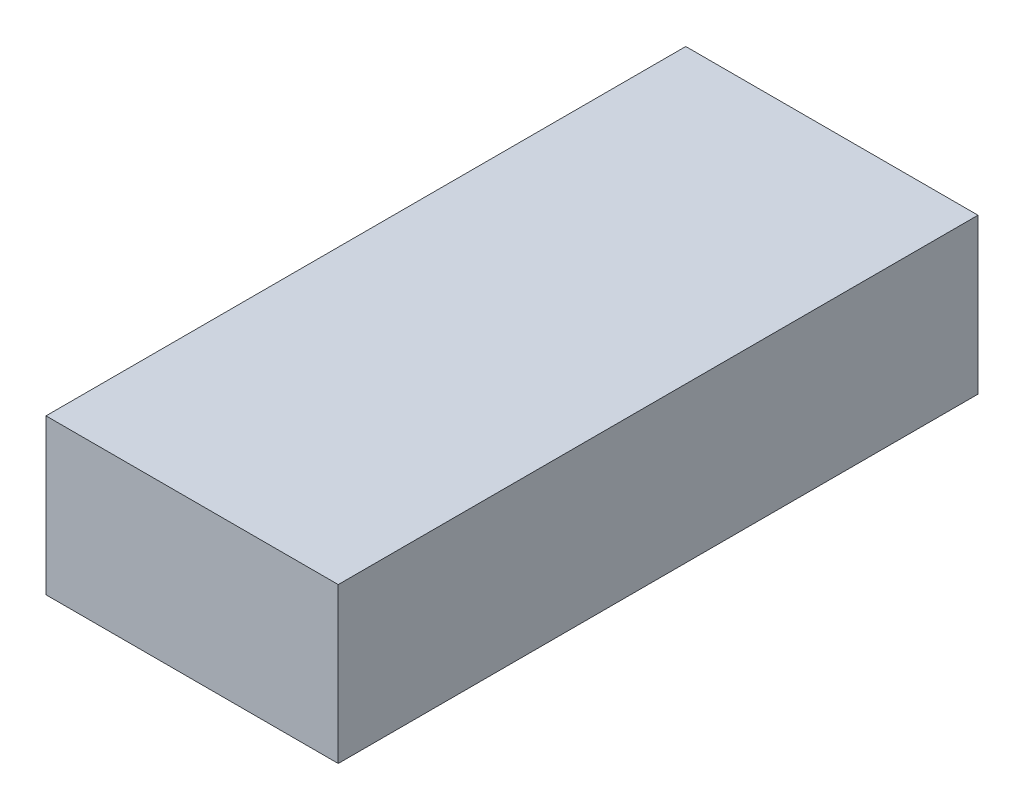
ISO-10303-21;
HEADER;
FILE_DESCRIPTION(('STEP AP214'),'2;1');
FILE_NAME('part.step','',(''),(''),'','','');
FILE_SCHEMA(('AUTOMOTIVE_DESIGN { 1 0 10303 214 1 1 1 1 }'));
ENDSEC;
DATA;
#1=APPLICATION_CONTEXT('core data for automotive mechanical design processes');
#2=APPLICATION_PROTOCOL_DEFINITION('international standard','automotive_design',2000,#1);
#3=PRODUCT_CONTEXT('',#1,'mechanical');
#4=PRODUCT('Part','Part','',(#3));
#5=PRODUCT_RELATED_PRODUCT_CATEGORY('part','',(#4));
#6=PRODUCT_DEFINITION_FORMATION('','',#4);
#7=PRODUCT_DEFINITION_CONTEXT('part definition',#1,'design');
#8=PRODUCT_DEFINITION('design','',#6,#7);
#9=PRODUCT_DEFINITION_SHAPE('','',#8);
#10=(LENGTH_UNIT() NAMED_UNIT(*) SI_UNIT(.MILLI.,.METRE.));
#11=(NAMED_UNIT(*) PLANE_ANGLE_UNIT() SI_UNIT($,.RADIAN.));
#12=(NAMED_UNIT(*) SI_UNIT($,.STERADIAN.) SOLID_ANGLE_UNIT());
#13=UNCERTAINTY_MEASURE_WITH_UNIT(LENGTH_MEASURE(1.E-05),#10,'distance_accuracy_value','');
#14=(GEOMETRIC_REPRESENTATION_CONTEXT(3) GLOBAL_UNCERTAINTY_ASSIGNED_CONTEXT((#13)) GLOBAL_UNIT_ASSIGNED_CONTEXT((#10,
#11,#12)) REPRESENTATION_CONTEXT('',''));
#15=CARTESIAN_POINT('',(0.,0.,0.));
#16=DIRECTION('',(0.,0.,1.));
#17=DIRECTION('',(1.,0.,0.));
#18=AXIS2_PLACEMENT_3D('',#15,#16,#17);
#19=CARTESIAN_POINT('',(21.28,22.57,-46.585));
#20=DIRECTION('',(-1.,0.,0.));
#21=DIRECTION('',(0.,0.,1.));
#22=AXIS2_PLACEMENT_3D('',#19,#20,#21);
#23=PLANE('',#22);
#24=DIRECTION('',(0.,0.,-1.));
#25=VECTOR('',#24,1.);
#26=CARTESIAN_POINT('',(21.28,0.,-46.585));
#27=LINE('',#26,#25);
#28=CARTESIAN_POINT('',(21.28,0.,46.585));
#29=VERTEX_POINT('',#28);
#30=CARTESIAN_POINT('',(21.28,0.,-46.585));
#31=VERTEX_POINT('',#30);
#32=EDGE_CURVE('E115',#29,#31,#27,.T.);
#33=ORIENTED_EDGE('',*,*,#32,.T.);
#34=DIRECTION('',(0.,-1.,0.));
#35=VECTOR('',#34,1.);
#36=CARTESIAN_POINT('',(21.28,22.57,-46.585));
#37=LINE('',#36,#35);
#38=CARTESIAN_POINT('',(21.28,22.57,-46.585));
#39=VERTEX_POINT('',#38);
#40=EDGE_CURVE('E11',#39,#31,#37,.T.);
#41=ORIENTED_EDGE('',*,*,#40,.F.);
#42=DIRECTION('',(0.,0.,-1.));
#43=VECTOR('',#42,1.);
#44=CARTESIAN_POINT('',(21.28,22.57,-46.585));
#45=LINE('',#44,#43);
#46=CARTESIAN_POINT('',(21.28,22.57,46.585));
#47=VERTEX_POINT('',#46);
#48=EDGE_CURVE('E99',#47,#39,#45,.T.);
#49=ORIENTED_EDGE('',*,*,#48,.F.);
#50=DIRECTION('',(0.,-1.,0.));
#51=VECTOR('',#50,1.);
#52=CARTESIAN_POINT('',(21.28,22.57,46.585));
#53=LINE('',#52,#51);
#54=EDGE_CURVE('E111',#47,#29,#53,.T.);
#55=ORIENTED_EDGE('',*,*,#54,.T.);
#56=EDGE_LOOP('',(#33,#41,#49,#55));
#57=FACE_BOUND('',#56,.T.);
#58=ADVANCED_FACE('F47',(#57),#23,.F.);
#59=CARTESIAN_POINT('',(-21.28,22.57,-46.585));
#60=DIRECTION('',(0.,0.,1.));
#61=DIRECTION('',(1.,0.,0.));
#62=AXIS2_PLACEMENT_3D('',#59,#60,#61);
#63=PLANE('',#62);
#64=DIRECTION('',(-1.,0.,0.));
#65=VECTOR('',#64,1.);
#66=CARTESIAN_POINT('',(-21.28,0.,-46.585));
#67=LINE('',#66,#65);
#68=CARTESIAN_POINT('',(-21.28,0.,-46.585));
#69=VERTEX_POINT('',#68);
#70=EDGE_CURVE('E104',#31,#69,#67,.T.);
#71=ORIENTED_EDGE('',*,*,#70,.T.);
#72=DIRECTION('',(0.,-1.,0.));
#73=VECTOR('',#72,1.);
#74=CARTESIAN_POINT('',(-21.28,22.57,-46.585));
#75=LINE('',#74,#73);
#76=CARTESIAN_POINT('',(-21.28,22.57,-46.585));
#77=VERTEX_POINT('',#76);
#78=EDGE_CURVE('E56',#77,#69,#75,.T.);
#79=ORIENTED_EDGE('',*,*,#78,.F.);
#80=DIRECTION('',(-1.,0.,0.));
#81=VECTOR('',#80,1.);
#82=CARTESIAN_POINT('',(-21.28,22.57,-46.585));
#83=LINE('',#82,#81);
#84=EDGE_CURVE('E94',#39,#77,#83,.T.);
#85=ORIENTED_EDGE('',*,*,#84,.F.);
#86=ORIENTED_EDGE('',*,*,#40,.T.);
#87=EDGE_LOOP('',(#71,#79,#85,#86));
#88=FACE_BOUND('',#87,.T.);
#89=ADVANCED_FACE('F103',(#88),#63,.F.);
#90=CARTESIAN_POINT('',(-21.28,22.57,-46.585));
#91=DIRECTION('',(1.,0.,0.));
#92=DIRECTION('',(0.,0.,-1.));
#93=AXIS2_PLACEMENT_3D('',#90,#91,#92);
#94=PLANE('',#93);
#95=DIRECTION('',(0.,0.,1.));
#96=VECTOR('',#95,1.);
#97=CARTESIAN_POINT('',(-21.28,0.,-46.585));
#98=LINE('',#97,#96);
#99=CARTESIAN_POINT('',(-21.28,0.,46.585));
#100=VERTEX_POINT('',#99);
#101=EDGE_CURVE('E81',#69,#100,#98,.T.);
#102=ORIENTED_EDGE('',*,*,#101,.T.);
#103=DIRECTION('',(0.,-1.,0.));
#104=VECTOR('',#103,1.);
#105=CARTESIAN_POINT('',(-21.28,22.57,46.585));
#106=LINE('',#105,#104);
#107=CARTESIAN_POINT('',(-21.28,22.57,46.585));
#108=VERTEX_POINT('',#107);
#109=EDGE_CURVE('E106',#108,#100,#106,.T.);
#110=ORIENTED_EDGE('',*,*,#109,.F.);
#111=DIRECTION('',(0.,0.,1.));
#112=VECTOR('',#111,1.);
#113=CARTESIAN_POINT('',(-21.28,22.57,-46.585));
#114=LINE('',#113,#112);
#115=EDGE_CURVE('E97',#77,#108,#114,.T.);
#116=ORIENTED_EDGE('',*,*,#115,.F.);
#117=ORIENTED_EDGE('',*,*,#78,.T.);
#118=EDGE_LOOP('',(#102,#110,#116,#117));
#119=FACE_BOUND('',#118,.T.);
#120=ADVANCED_FACE('F107',(#119),#94,.F.);
#121=CARTESIAN_POINT('',(-21.28,22.57,46.585));
#122=DIRECTION('',(0.,0.,-1.));
#123=DIRECTION('',(-1.,0.,0.));
#124=AXIS2_PLACEMENT_3D('',#121,#122,#123);
#125=PLANE('',#124);
#126=DIRECTION('',(1.,0.,0.));
#127=VECTOR('',#126,1.);
#128=CARTESIAN_POINT('',(-21.28,0.,46.585));
#129=LINE('',#128,#127);
#130=EDGE_CURVE('E87',#100,#29,#129,.T.);
#131=ORIENTED_EDGE('',*,*,#130,.T.);
#132=ORIENTED_EDGE('',*,*,#54,.F.);
#133=DIRECTION('',(1.,0.,0.));
#134=VECTOR('',#133,1.);
#135=CARTESIAN_POINT('',(-21.28,22.57,46.585));
#136=LINE('',#135,#134);
#137=EDGE_CURVE('E64',#108,#47,#136,.T.);
#138=ORIENTED_EDGE('',*,*,#137,.F.);
#139=ORIENTED_EDGE('',*,*,#109,.T.);
#140=EDGE_LOOP('',(#131,#132,#138,#139));
#141=FACE_BOUND('',#140,.T.);
#142=ADVANCED_FACE('F128',(#141),#125,.F.);
#143=CARTESIAN_POINT('',(0.,22.57,0.));
#144=DIRECTION('',(0.,1.,0.));
#145=DIRECTION('',(0.,0.,1.));
#146=AXIS2_PLACEMENT_3D('',#143,#144,#145);
#147=PLANE('',#146);
#148=ORIENTED_EDGE('',*,*,#48,.T.);
#149=ORIENTED_EDGE('',*,*,#84,.T.);
#150=ORIENTED_EDGE('',*,*,#115,.T.);
#151=ORIENTED_EDGE('',*,*,#137,.T.);
#152=EDGE_LOOP('',(#148,#149,#150,#151));
#153=FACE_BOUND('',#152,.T.);
#154=ADVANCED_FACE('F95',(#153),#147,.T.);
#155=CARTESIAN_POINT('',(0.,0.,0.));
#156=DIRECTION('',(0.,1.,0.));
#157=DIRECTION('',(0.,0.,1.));
#158=AXIS2_PLACEMENT_3D('',#155,#156,#157);
#159=PLANE('',#158);
#160=ORIENTED_EDGE('',*,*,#32,.F.);
#161=ORIENTED_EDGE('',*,*,#130,.F.);
#162=ORIENTED_EDGE('',*,*,#101,.F.);
#163=ORIENTED_EDGE('',*,*,#70,.F.);
#164=EDGE_LOOP('',(#160,#161,#162,#163));
#165=FACE_BOUND('',#164,.T.);
#166=ADVANCED_FACE('F131',(#165),#159,.F.);
#167=CLOSED_SHELL('',(#58,#89,#120,#142,#154,#166));
#168=MANIFOLD_SOLID_BREP('B2',#167);
#169=ADVANCED_BREP_SHAPE_REPRESENTATION('',(#18,#168),#14);
#170=SHAPE_DEFINITION_REPRESENTATION(#9,#169);
ENDSEC;
END-ISO-10303-21;
